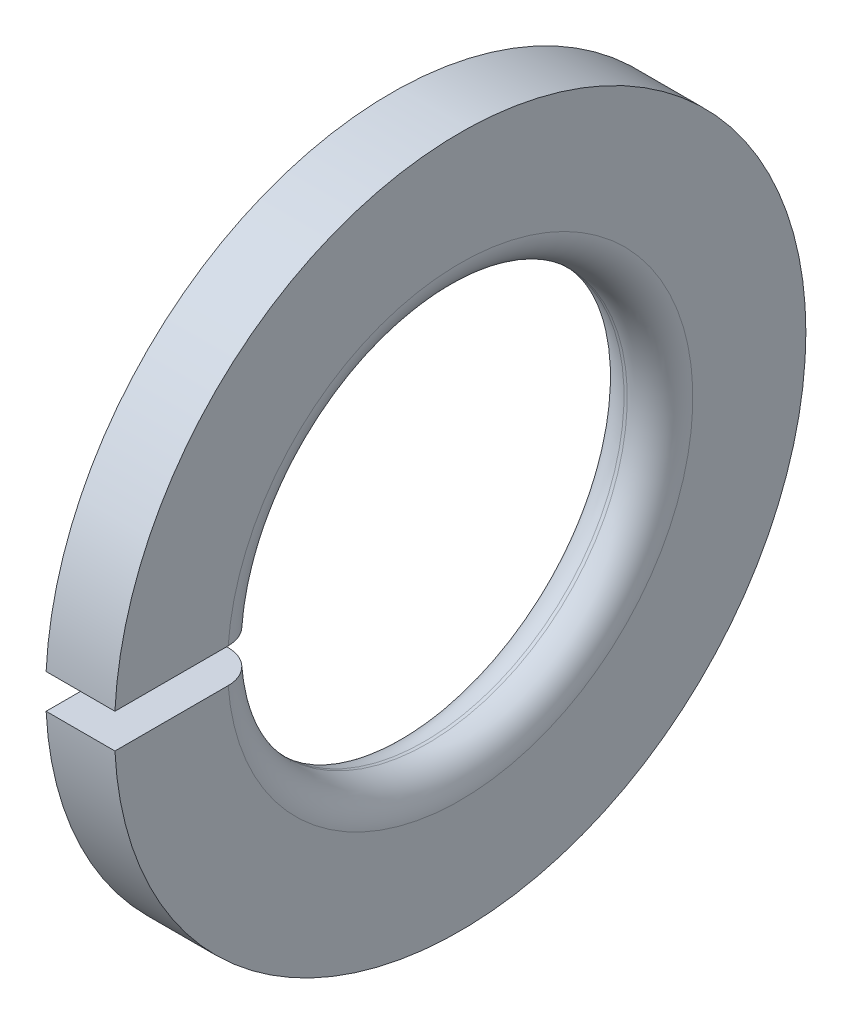
ISO-10303-21;
HEADER;
FILE_DESCRIPTION(('STEP AP214'),'2;1');
FILE_NAME('part.step','',(''),(''),'','','');
FILE_SCHEMA(('AUTOMOTIVE_DESIGN { 1 0 10303 214 1 1 1 1 }'));
ENDSEC;
DATA;
#1=APPLICATION_CONTEXT('core data for automotive mechanical design processes');
#2=APPLICATION_PROTOCOL_DEFINITION('international standard','automotive_design',2000,#1);
#3=PRODUCT_CONTEXT('',#1,'mechanical');
#4=PRODUCT('Part','Part','',(#3));
#5=PRODUCT_RELATED_PRODUCT_CATEGORY('part','',(#4));
#6=PRODUCT_DEFINITION_FORMATION('','',#4);
#7=PRODUCT_DEFINITION_CONTEXT('part definition',#1,'design');
#8=PRODUCT_DEFINITION('design','',#6,#7);
#9=PRODUCT_DEFINITION_SHAPE('','',#8);
#10=(LENGTH_UNIT() NAMED_UNIT(*) SI_UNIT(.MILLI.,.METRE.));
#11=(NAMED_UNIT(*) PLANE_ANGLE_UNIT() SI_UNIT($,.RADIAN.));
#12=(NAMED_UNIT(*) SI_UNIT($,.STERADIAN.) SOLID_ANGLE_UNIT());
#13=UNCERTAINTY_MEASURE_WITH_UNIT(LENGTH_MEASURE(1.E-05),#10,'distance_accuracy_value','');
#14=(GEOMETRIC_REPRESENTATION_CONTEXT(3) GLOBAL_UNCERTAINTY_ASSIGNED_CONTEXT((#13)) GLOBAL_UNIT_ASSIGNED_CONTEXT((#10,
#11,#12)) REPRESENTATION_CONTEXT('',''));
#15=CARTESIAN_POINT('',(0.,0.,0.));
#16=DIRECTION('',(0.,0.,1.));
#17=DIRECTION('',(1.,0.,0.));
#18=AXIS2_PLACEMENT_3D('',#15,#16,#17);
#19=CARTESIAN_POINT('',(-34.925,-3.67761376907083E-13,0.));
#20=DIRECTION('',(-1.,0.,0.));
#21=DIRECTION('',(0.,0.,1.));
#22=AXIS2_PLACEMENT_3D('',#19,#20,#21);
#23=CYLINDRICAL_SURFACE('',#22,10.55);
#24=DIRECTION('',(-1.,0.,0.));
#25=VECTOR('',#24,1.);
#26=CARTESIAN_POINT('',(-34.925,0.52499999999963,10.5369291067179));
#27=LINE('',#26,#25);
#28=CARTESIAN_POINT('',(-5.99520433297585E-12,0.524999999999991,10.5369291067179));
#29=VERTEX_POINT('',#28);
#30=CARTESIAN_POINT('',(-2.10000000000599,0.524999999999991,10.5369291067165));
#31=VERTEX_POINT('',#30);
#32=EDGE_CURVE('E45',#29,#31,#27,.T.);
#33=ORIENTED_EDGE('',*,*,#32,.F.);
#34=CARTESIAN_POINT('',(0.,0.,0.));
#35=DIRECTION('',(-1.,0.,0.));
#36=DIRECTION('',(0.,0.,1.));
#37=AXIS2_PLACEMENT_3D('',#34,#35,#36);
#38=CIRCLE('',#37,10.55);
#39=CARTESIAN_POINT('',(-5.99520433297585E-12,-0.524999999999991,10.5369291067179));
#40=VERTEX_POINT('',#39);
#41=EDGE_CURVE('E106',#29,#40,#38,.T.);
#42=ORIENTED_EDGE('',*,*,#41,.T.);
#43=DIRECTION('',(-1.,0.,0.));
#44=VECTOR('',#43,1.);
#45=CARTESIAN_POINT('',(-34.9250000000059,-0.525000000000019,10.5369291067194));
#46=LINE('',#45,#44);
#47=CARTESIAN_POINT('',(-2.10000000000599,-0.524999999999998,10.5369291067179));
#48=VERTEX_POINT('',#47);
#49=EDGE_CURVE('E87',#48,#40,#46,.F.);
#50=ORIENTED_EDGE('',*,*,#49,.F.);
#51=CARTESIAN_POINT('',(-2.09999999999999,0.,-1.49880108324396E-12));
#52=DIRECTION('',(-1.,0.,0.));
#53=DIRECTION('',(0.,0.,1.));
#54=AXIS2_PLACEMENT_3D('',#51,#52,#53);
#55=CIRCLE('',#54,10.55);
#56=EDGE_CURVE('E118',#31,#48,#55,.T.);
#57=ORIENTED_EDGE('',*,*,#56,.F.);
#58=EDGE_LOOP('',(#33,#42,#50,#57));
#59=FACE_BOUND('',#58,.T.);
#60=ADVANCED_FACE('F32',(#59),#23,.T.);
#61=CARTESIAN_POINT('',(-2.99760216648792E-12,7.10000000000002,1.49880108324396E-12));
#62=DIRECTION('',(-1.,0.,0.));
#63=DIRECTION('',(0.,0.,1.));
#64=AXIS2_PLACEMENT_3D('',#61,#62,#63);
#65=PLANE('',#64);
#66=DIRECTION('',(0.,0.,-1.));
#67=VECTOR('',#66,1.);
#68=CARTESIAN_POINT('',(-5.99520433297585E-12,0.525000000000365,10.761000000003));
#69=LINE('',#68,#67);
#70=CARTESIAN_POINT('',(-5.99520433297585E-12,0.525000000000372,7.08056318381822));
#71=VERTEX_POINT('',#70);
#72=EDGE_CURVE('E92',#29,#71,#69,.T.);
#73=ORIENTED_EDGE('',*,*,#72,.T.);
#74=CARTESIAN_POINT('',(0.,0.,0.));
#75=DIRECTION('',(-1.,0.,0.));
#76=DIRECTION('',(0.,0.,1.));
#77=AXIS2_PLACEMENT_3D('',#74,#75,#76);
#78=CIRCLE('',#77,7.1);
#79=CARTESIAN_POINT('',(-5.99520433297585E-12,-0.524999999999998,7.08056318381528));
#80=VERTEX_POINT('',#79);
#81=EDGE_CURVE('E99',#71,#80,#78,.T.);
#82=ORIENTED_EDGE('',*,*,#81,.T.);
#83=DIRECTION('',(0.,0.,1.));
#84=VECTOR('',#83,1.);
#85=CARTESIAN_POINT('',(0.,-0.524999999999991,1.49880108324396E-12));
#86=LINE('',#85,#84);
#87=EDGE_CURVE('E81',#80,#40,#86,.T.);
#88=ORIENTED_EDGE('',*,*,#87,.T.);
#89=ORIENTED_EDGE('',*,*,#41,.F.);
#90=EDGE_LOOP('',(#73,#82,#88,#89));
#91=FACE_BOUND('',#90,.T.);
#92=ADVANCED_FACE('F105',(#91),#65,.F.);
#93=CARTESIAN_POINT('',(-1.,0.,0.));
#94=DIRECTION('',(-1.,0.,0.));
#95=DIRECTION('',(0.,0.,1.));
#96=AXIS2_PLACEMENT_3D('',#93,#94,#95);
#97=TOROIDAL_SURFACE('',#96,7.1,1.);
#98=ORIENTED_EDGE('',*,*,#81,.F.);
#99=CARTESIAN_POINT('',(-0.812651191739011,0.525000000000386,6.09513809676693));
#100=CARTESIAN_POINT('',(-0.86763560161535,0.52500000000039,6.08461486650558));
#101=CARTESIAN_POINT('',(-0.923548451891167,0.52500000000056,6.07872721250463));
#102=CARTESIAN_POINT('',(-1.03561462487389,0.525000000000171,6.07642288324821));
#103=CARTESIAN_POINT('',(-1.09176815419882,0.524999999999612,6.08001745453107));
#104=CARTESIAN_POINT('',(-1.20265038202974,0.524999999999634,6.09658440071834));
#105=CARTESIAN_POINT('',(-1.2573797852221,0.525000000000213,6.10955204256761));
#106=CARTESIAN_POINT('',(-1.36387256726086,0.525000000000518,6.14448072558383));
#107=CARTESIAN_POINT('',(-1.41563665184332,0.525000000000245,6.16643961664135));
#108=CARTESIAN_POINT('',(-1.51480465325536,0.525000000000194,6.21874173811415));
#109=CARTESIAN_POINT('',(-1.56220424215102,0.525000000000417,6.24909317391763));
#110=CARTESIAN_POINT('',(-1.65125714514086,0.525000000000314,6.31730121336978));
#111=CARTESIAN_POINT('',(-1.69291015600964,0.524999999999988,6.35515821280227));
#112=CARTESIAN_POINT('',(-1.7694226607442,0.525000000000008,6.43742442778355));
#113=CARTESIAN_POINT('',(-1.80426101306152,0.525000000000356,6.48185330578156));
#114=CARTESIAN_POINT('',(-1.86601254338754,0.525000000000375,6.57591381055366));
#115=CARTESIAN_POINT('',(-1.89292559207468,0.525000000000046,6.62554552220737));
#116=CARTESIAN_POINT('',(-1.93814923335575,0.524999999999991,6.72877362821629));
#117=CARTESIAN_POINT('',(-1.9564321571567,0.525000000000267,6.7823821453458));
#118=CARTESIAN_POINT('',(-1.98375580773819,0.525000000000464,6.89190498853988));
#119=CARTESIAN_POINT('',(-1.99279644617394,0.525000000000384,6.94781933664002));
#120=CARTESIAN_POINT('',(-2.00138749269965,0.525000000000333,7.0604687673077));
#121=CARTESIAN_POINT('',(-2.00092170716755,0.525000000000364,7.11720508578948));
#122=CARTESIAN_POINT('',(-1.99046919624121,0.525000000000367,7.22979418626571));
#123=CARTESIAN_POINT('',(-1.98048245114651,0.525000000000341,7.28564696643172));
#124=CARTESIAN_POINT('',(-1.95126829992547,0.525000000000389,7.3948656681672));
#125=CARTESIAN_POINT('',(-1.93204335803151,0.525000000000464,7.44823224875338));
#126=CARTESIAN_POINT('',(-1.88489151384702,0.525000000000267,7.55097199946538));
#127=CARTESIAN_POINT('',(-1.85696468215028,0.524999999999996,7.60034520198325));
#128=CARTESIAN_POINT('',(-1.79325165045152,0.524999999999999,7.69360308767863));
#129=CARTESIAN_POINT('',(-1.75747923414322,0.525000000000272,7.73749718732821));
#130=CARTESIAN_POINT('',(-1.67905745238101,0.525000000000459,7.81863927947436));
#131=CARTESIAN_POINT('',(-1.63640816840962,0.525000000000373,7.85588735070727));
#132=CARTESIAN_POINT('',(-1.54554883853784,0.525000000000372,7.92258902486344));
#133=CARTESIAN_POINT('',(-1.49735183074975,0.525000000000457,7.9520603881383));
#134=CARTESIAN_POINT('',(-1.39668650789791,0.525000000000274,8.00247439358047));
#135=CARTESIAN_POINT('',(-1.34421824229749,0.525000000000006,8.02341713449668));
#136=CARTESIAN_POINT('',(-1.23661255134114,0.525000000000003,8.056138017909));
#137=CARTESIAN_POINT('',(-1.18148066020991,0.525000000000267,8.06793436177014));
#138=CARTESIAN_POINT('',(-1.07001859144208,0.525000000000464,8.0820925822364));
#139=CARTESIAN_POINT('',(-1.01368842281035,0.525000000000396,8.08445452971429));
#140=CARTESIAN_POINT('',(-0.901493761664661,0.525000000000349,8.07967876415247));
#141=CARTESIAN_POINT('',(-0.845628830367014,0.525000000000369,8.07255135099623));
#142=CARTESIAN_POINT('',(-0.735888488378813,0.525000000000362,8.04901957603985));
#143=CARTESIAN_POINT('',(-0.682013074241086,0.525000000000336,8.03261523031435));
#144=CARTESIAN_POINT('',(-0.577772993939425,0.525000000000395,7.99099755957913));
#145=CARTESIAN_POINT('',(-0.527408710822,0.52500000000048,7.96578327524829));
#146=CARTESIAN_POINT('',(-0.43162095206121,0.525000000000251,7.90726737931806));
#147=CARTESIAN_POINT('',(-0.386197502193826,0.524999999999937,7.87396572553036));
#148=CARTESIAN_POINT('',(-0.301516745680129,0.525000000000045,7.80017762775498));
#149=CARTESIAN_POINT('',(-0.262267364873754,0.525000000000468,7.75968208841055));
#150=CARTESIAN_POINT('',(-0.191107272333072,0.525000000000263,7.67268846367339));
#151=CARTESIAN_POINT('',(-0.159196627383164,0.524999999999636,7.62619032366144));
#152=CARTESIAN_POINT('',(-0.10354735848934,0.524999999999638,7.52840777006957));
#153=CARTESIAN_POINT('',(-0.0798260108367196,0.525000000000269,7.47711352456593));
#154=CARTESIAN_POINT('',(-0.0413094029129745,0.525000000000462,7.37127661987449));
#155=CARTESIAN_POINT('',(-0.0265142736285594,0.525000000000024,7.31673391303043));
#156=CARTESIAN_POINT('',(-0.00623645855394657,0.524999999999972,7.20581585945597));
#157=CARTESIAN_POINT('',(-0.00077499732796008,0.52500000000036,7.14943663215186));
#158=CARTESIAN_POINT('',(0.000621201945867997,0.525000000000371,7.03656007759891));
#159=CARTESIAN_POINT('',(-0.00344418248303187,0.524999999999994,6.98006274884109));
#160=CARTESIAN_POINT('',(-0.020998863046643,0.524999999999987,6.86845999383274));
#161=CARTESIAN_POINT('',(-0.0345029987109019,0.525000000000358,6.81335690113727));
#162=CARTESIAN_POINT('',(-0.0705702232947276,0.525000000000373,6.70620167760592));
#163=CARTESIAN_POINT('',(-0.093132990136018,0.525000000000018,6.65414943837279));
#164=CARTESIAN_POINT('',(-0.146679335352683,0.524999999999964,6.55458295560851));
#165=CARTESIAN_POINT('',(-0.177661656099592,0.525000000000266,6.50706803576941));
#166=CARTESIAN_POINT('',(-0.247187964173523,0.525000000000465,6.41791501138081));
#167=CARTESIAN_POINT('',(-0.28573376834286,0.525000000000362,6.37627832299549));
#168=CARTESIAN_POINT('',(-0.369221248758107,0.525000000000369,6.30015644019459));
#169=CARTESIAN_POINT('',(-0.41415296357716,0.52500000000048,6.26566030926566));
#170=CARTESIAN_POINT('',(-0.509152346902679,0.525000000000252,6.2047670808795));
#171=CARTESIAN_POINT('',(-0.559213645070665,0.524999999999914,6.17836009650292));
#172=CARTESIAN_POINT('',(-0.643498874890684,0.525000000000061,6.142647466267));
#173=CARTESIAN_POINT('',(-0.676607139323993,0.525000000000285,6.13064415459991));
#174=CARTESIAN_POINT('',(-0.743905094984735,0.525000000000446,6.11019627403339));
#175=CARTESIAN_POINT('',(-0.778094784431846,0.525000000000384,6.10175169927564));
#176=CARTESIAN_POINT('',(-0.812651191739011,0.525000000000386,6.09513809676693));
#177=B_SPLINE_CURVE_WITH_KNOTS('',3,(#99,#100,#101,#102,#103,#104,#105,#106,#107,#108,#109,#110,
#111,#112,#113,#114,#115,#116,#117,#118,#119,#120,#121,#122,#123,#124,#125,#126,#127,#128,#129,
#130,#131,#132,#133,#134,#135,#136,#137,#138,#139,#140,#141,#142,#143,#144,#145,#146,#147,#148,
#149,#150,#151,#152,#153,#154,#155,#156,#157,#158,#159,#160,#161,#162,#163,#164,#165,#166,#167,
#168,#169,#170,#171,#172,#173,#174,#175,#176),.UNSPECIFIED.,.T.,.F.,(4,2,2,2,2,2,2,2,2,2,2,2,2,
2,2,2,2,2,2,2,2,2,2,2,2,2,2,2,2,2,2,2,2,2,2,2,2,2,4),(0.,0.167818610444027,0.335836354186265,
0.503769314380889,0.671662139600822,0.839719697545483,1.00778611986899,1.1763659518579,
1.34494853450503,1.51406799423438,1.68318907052102,1.85259825840784,2.02200779683156,
2.19137217136273,2.36073517196684,2.5298029734636,2.6988687718595,2.86754505097584,
3.03621937701346,3.20455717280994,3.37289370402228,3.54104766930881,3.70920134322669,
3.87737333323923,4.04554620055123,4.21393322499854,4.3823217817508,4.55106343388026,
4.71980756212841,4.8889349028952,5.05806441796815,5.2274604369871,5.39685043368923,
5.56621514250759,5.7356205847397,5.90476461293485,6.07370107312212,6.17917129306022,
6.2846413393746),.UNSPECIFIED.);
#178=CARTESIAN_POINT('',(-1.000000000006,0.524999999999644,6.07736579448698));
#179=VERTEX_POINT('',#178);
#180=EDGE_CURVE('E125',#71,#179,#177,.T.);
#181=ORIENTED_EDGE('',*,*,#180,.T.);
#182=CARTESIAN_POINT('',(-1.,0.,0.));
#183=DIRECTION('',(-1.,0.,0.));
#184=DIRECTION('',(0.,0.,1.));
#185=AXIS2_PLACEMENT_3D('',#182,#183,#184);
#186=CIRCLE('',#185,6.1);
#187=CARTESIAN_POINT('',(-1.000000000006,-0.525000000000372,6.07736579448842));
#188=VERTEX_POINT('',#187);
#189=EDGE_CURVE('E101',#179,#188,#186,.T.);
#190=ORIENTED_EDGE('',*,*,#189,.T.);
#191=CARTESIAN_POINT('',(-0.812651191739011,-0.52499999999963,6.09513809676687));
#192=CARTESIAN_POINT('',(-0.757551820383527,-0.524999999999582,6.10568846941272));
#193=CARTESIAN_POINT('',(-0.703304669045682,-0.524999999999881,6.12090939679912));
#194=CARTESIAN_POINT('',(-0.59809494605691,-0.525000000000101,6.16026480787424));
#195=CARTESIAN_POINT('',(-0.547136476731266,-0.525000000000022,6.18441018084307));
#196=CARTESIAN_POINT('',(-0.450021059867926,-0.524999999999959,6.24089704258308));
#197=CARTESIAN_POINT('',(-0.403861219141078,-0.524999999999976,6.27323355185655));
#198=CARTESIAN_POINT('',(-0.317622415274921,-0.525000000000005,6.34517125918391));
#199=CARTESIAN_POINT('',(-0.277541983739865,-0.525000000000018,6.38477069785813));
#200=CARTESIAN_POINT('',(-0.204475274851348,-0.524999999999963,6.47021702811084));
#201=CARTESIAN_POINT('',(-0.171506620943298,-0.524999999999895,6.51607899006744));
#202=CARTESIAN_POINT('',(-0.113707633490496,-0.525000000000087,6.6126750006093));
#203=CARTESIAN_POINT('',(-0.0888777550488546,-0.525000000000348,6.66340932144153));
#204=CARTESIAN_POINT('',(-0.0479873967017835,-0.525000000000397,6.76847554061448));
#205=CARTESIAN_POINT('',(-0.0319538960510874,-0.525000000000184,6.82281794020373));
#206=CARTESIAN_POINT('',(-0.00922268898939762,-0.524999999999797,6.93342153693535));
#207=CARTESIAN_POINT('',(-0.00252506206479261,-0.524999999999623,6.98968275041049));
#208=CARTESIAN_POINT('',(0.00134687490064148,-0.524999999999623,7.10261487774892));
#209=CARTESIAN_POINT('',(-0.00149276131561704,-0.524999999999799,7.15928627056638));
#210=CARTESIAN_POINT('',(-0.0166506062855857,-0.525000000000182,7.27134714691431));
#211=CARTESIAN_POINT('',(-0.0289687946271112,-0.52500000000039,7.3267366332051));
#212=CARTESIAN_POINT('',(-0.0627331922052648,-0.525000000000341,7.43463047401095));
#213=CARTESIAN_POINT('',(-0.0841749236068021,-0.525000000000085,7.48713622960659));
#214=CARTESIAN_POINT('',(-0.135585095868142,-0.524999999999897,7.58779315210848));
#215=CARTESIAN_POINT('',(-0.165553473441034,-0.524999999999965,7.63594435133184));
#216=CARTESIAN_POINT('',(-0.233108214583372,-0.525000000000017,7.72642784102541));
#217=CARTESIAN_POINT('',(-0.270680263460048,-0.525000000000001,7.7687708184043));
#218=CARTESIAN_POINT('',(-0.352414617323743,-0.524999999999981,7.84652983199612));
#219=CARTESIAN_POINT('',(-0.396576839435855,-0.524999999999976,7.88194595530494));
#220=CARTESIAN_POINT('',(-0.490128313923088,-0.525000000000033,7.94475961565226));
#221=CARTESIAN_POINT('',(-0.539505264717276,-0.525000000000094,7.97217547432841));
#222=CARTESIAN_POINT('',(-0.642167542778622,-0.524999999999888,8.01831006363455));
#223=CARTESIAN_POINT('',(-0.695452826774186,-0.524999999999622,8.03702889053799));
#224=CARTESIAN_POINT('',(-0.804309707927125,-0.524999999999624,8.06520338795604));
#225=CARTESIAN_POINT('',(-0.859876747633011,-0.524999999999892,8.07467666879472));
#226=CARTESIAN_POINT('',(-0.971812435773961,-0.525000000000089,8.08415006833431));
#227=CARTESIAN_POINT('',(-1.02818107864394,-0.525000000000019,8.08415025276961));
#228=CARTESIAN_POINT('',(-1.1400634617036,-0.525000000000019,8.0746820931035));
#229=CARTESIAN_POINT('',(-1.19557795970516,-0.525000000000089,8.06522270014537));
#230=CARTESIAN_POINT('',(-1.30423144094737,-0.524999999999892,8.03712034151092));
#231=CARTESIAN_POINT('',(-1.35737042598148,-0.524999999999624,8.01847738276809));
#232=CARTESIAN_POINT('',(-1.45978125760765,-0.524999999999622,7.97253595372823));
#233=CARTESIAN_POINT('',(-1.50905208951595,-0.524999999999887,7.94523522174864));
#234=CARTESIAN_POINT('',(-1.6023193775826,-0.525000000000095,7.88276033178027));
#235=CARTESIAN_POINT('',(-1.64631580509632,-0.525000000000038,7.84758613103467));
#236=CARTESIAN_POINT('',(-1.72785344321041,-0.524999999999986,7.77031242493913));
#237=CARTESIAN_POINT('',(-1.76538552963427,-0.524999999999991,7.72820329244019));
#238=CARTESIAN_POINT('',(-1.83286562277719,-0.524999999999991,7.63829324855417));
#239=CARTESIAN_POINT('',(-1.86281354537835,-0.524999999999986,7.59049227404607));
#240=CARTESIAN_POINT('',(-1.91434492958983,-0.525000000000037,7.49044548050609));
#241=CARTESIAN_POINT('',(-1.93591017809057,-0.525000000000094,7.4381902805621));
#242=CARTESIAN_POINT('',(-1.96998371435096,-0.524999999999887,7.33080620793293));
#243=CARTESIAN_POINT('',(-1.98249189522443,-0.524999999999623,7.27567730134219));
#244=CARTESIAN_POINT('',(-1.9981234719868,-0.524999999999623,7.16397881234709));
#245=CARTESIAN_POINT('',(-2.00122582734279,-0.524999999999889,7.10740628502683));
#246=CARTESIAN_POINT('',(-1.99790326108501,-0.525000000000093,6.99454140302635));
#247=CARTESIAN_POINT('',(-1.99147822288672,-0.525000000000031,6.93824905178304));
#248=CARTESIAN_POINT('',(-1.96926763972439,-0.524999999999978,6.82745983678992));
#249=CARTESIAN_POINT('',(-1.95346900171992,-0.524999999999987,6.77296559724879));
#250=CARTESIAN_POINT('',(-1.91294486876417,-0.524999999999994,6.66740346112882));
#251=CARTESIAN_POINT('',(-1.88821933806418,-0.524999999999992,6.61633557827217));
#252=CARTESIAN_POINT('',(-1.83054378341638,-0.524999999999989,6.51909489101593));
#253=CARTESIAN_POINT('',(-1.79759596406104,-0.524999999999988,6.47292077919953));
#254=CARTESIAN_POINT('',(-1.72440111454963,-0.524999999999994,6.38677676254131));
#255=CARTESIAN_POINT('',(-1.68415444354468,-0.525000000000001,6.34680655260657));
#256=CARTESIAN_POINT('',(-1.59760183616129,-0.524999999999994,6.27430667984283));
#257=CARTESIAN_POINT('',(-1.55131036393126,-0.524999999999981,6.2417597494312));
#258=CARTESIAN_POINT('',(-1.45389218246537,-0.525000000000001,6.18492227475709));
#259=CARTESIAN_POINT('',(-1.40276435945105,-0.525000000000035,6.16063363826905));
#260=CARTESIAN_POINT('',(-1.29730119775418,-0.524999999999974,6.12108940160269));
#261=CARTESIAN_POINT('',(-1.24297553120601,-0.52499999999988,6.10580796129352));
#262=CARTESIAN_POINT('',(-1.13257168096271,-0.525000000000102,6.08463105977216));
#263=CARTESIAN_POINT('',(-1.07649573567946,-0.525000000000418,6.07872407381989));
#264=CARTESIAN_POINT('',(-0.985554768614343,-0.525000000000333,6.07686069334207));
#265=CARTESIAN_POINT('',(-0.950724049165604,-0.525000000000159,6.07797678644243));
#266=CARTESIAN_POINT('',(-0.881369871437204,-0.524999999999822,6.08384165906412));
#267=CARTESIAN_POINT('',(-0.846846412434104,-0.52499999999966,6.08859043003012));
#268=CARTESIAN_POINT('',(-0.812651191739011,-0.52499999999963,6.09513809676687));
#269=B_SPLINE_CURVE_WITH_KNOTS('',3,(#191,#192,#193,#194,#195,#196,#197,#198,#199,#200,#201,
#202,#203,#204,#205,#206,#207,#208,#209,#210,#211,#212,#213,#214,#215,#216,#217,#218,#219,#220,
#221,#222,#223,#224,#225,#226,#227,#228,#229,#230,#231,#232,#233,#234,#235,#236,#237,#238,#239,
#240,#241,#242,#243,#244,#245,#246,#247,#248,#249,#250,#251,#252,#253,#254,#255,#256,#257,#258,
#259,#260,#261,#262,#263,#264,#265,#266,#267,#268),.UNSPECIFIED.,.T.,.F.,(4,2,2,2,2,2,2,2,2,2,2,
2,2,2,2,2,2,2,2,2,2,2,2,2,2,2,2,2,2,2,2,2,2,2,2,2,2,2,4),(0.,0.168173561321617,
0.336553002906382,0.504830329078898,0.673066945285205,0.841715791619334,1.0103740668321,
1.17954678020889,1.34872093392713,1.51814257718406,1.6875638555903,1.8569020777685,
2.02623904310866,2.19526013121228,2.36427909396563,2.53290788785009,2.7015348150217,
2.86983992190338,3.03814386090582,3.20628869253537,3.37443339721767,3.54262206281626,
3.71081164178454,3.87923670252184,4.04766363122281,4.21645448401653,4.38524732874826,
4.55441748015038,4.7235897016659,4.89299878102369,5.06240853880611,5.2317729224874,
5.40112897459627,5.57008696917327,5.73908396879025,5.90759375448957,6.07589621718153,
6.18026665638203,6.28463684977989),.UNSPECIFIED.);
#270=EDGE_CURVE('E84',#188,#80,#269,.T.);
#271=ORIENTED_EDGE('',*,*,#270,.T.);
#272=EDGE_LOOP('',(#98,#181,#190,#271));
#273=FACE_BOUND('',#272,.T.);
#274=ADVANCED_FACE('F97',(#273),#97,.T.);
#275=CARTESIAN_POINT('',(-34.925,-3.67761376907083E-13,0.));
#276=DIRECTION('',(-1.,0.,0.));
#277=DIRECTION('',(0.,0.,1.));
#278=AXIS2_PLACEMENT_3D('',#275,#276,#277);
#279=CYLINDRICAL_SURFACE('',#278,6.1);
#280=DIRECTION('',(-1.,0.,0.));
#281=VECTOR('',#280,1.);
#282=CARTESIAN_POINT('',(-34.9250000000059,0.524999999999991,6.07736579448692));
#283=LINE('',#282,#281);
#284=CARTESIAN_POINT('',(-1.10000000000599,0.524999999999991,6.07736579448698));
#285=VERTEX_POINT('',#284);
#286=EDGE_CURVE('E133',#285,#179,#283,.F.);
#287=ORIENTED_EDGE('',*,*,#286,.F.);
#288=CARTESIAN_POINT('',(-1.09999999999999,-3.67761376907083E-13,0.));
#289=DIRECTION('',(-1.,0.,0.));
#290=DIRECTION('',(0.,0.,1.));
#291=AXIS2_PLACEMENT_3D('',#288,#289,#290);
#292=CIRCLE('',#291,6.1);
#293=CARTESIAN_POINT('',(-1.10000000000599,-0.525000000000379,6.07736579448842));
#294=VERTEX_POINT('',#293);
#295=EDGE_CURVE('E109',#285,#294,#292,.T.);
#296=ORIENTED_EDGE('',*,*,#295,.T.);
#297=DIRECTION('',(-1.,0.,0.));
#298=VECTOR('',#297,1.);
#299=CARTESIAN_POINT('',(-34.9250000000059,-0.525000000000012,6.07736579448842));
#300=LINE('',#299,#298);
#301=EDGE_CURVE('E102',#188,#294,#300,.T.);
#302=ORIENTED_EDGE('',*,*,#301,.F.);
#303=ORIENTED_EDGE('',*,*,#189,.F.);
#304=EDGE_LOOP('',(#287,#296,#302,#303));
#305=FACE_BOUND('',#304,.T.);
#306=ADVANCED_FACE('F132',(#305),#279,.F.);
#307=CARTESIAN_POINT('',(-1.09999999999999,-3.67761376907083E-13,0.));
#308=DIRECTION('',(-1.,0.,0.));
#309=DIRECTION('',(0.,0.,1.));
#310=AXIS2_PLACEMENT_3D('',#307,#308,#309);
#311=TOROIDAL_SURFACE('',#310,7.1,1.);
#312=ORIENTED_EDGE('',*,*,#295,.F.);
#313=CARTESIAN_POINT('',(-1.5961819299769,0.525000000000019,6.2096275846848));
#314=CARTESIAN_POINT('',(-1.64499939934069,0.524999999999903,6.23762894619343));
#315=CARTESIAN_POINT('',(-1.69148224423684,0.525000000000346,6.26978458655136));
#316=CARTESIAN_POINT('',(-1.77842234714044,0.525000000000384,6.34147727590411));
#317=CARTESIAN_POINT('',(-1.81887203434511,0.524999999999978,6.38102346122214));
#318=CARTESIAN_POINT('',(-1.89254170806743,0.525000000000017,6.46632022317165));
#319=CARTESIAN_POINT('',(-1.92576613310789,0.525000000000462,6.51206696256452));
#320=CARTESIAN_POINT('',(-1.98407371178963,0.525000000000269,6.60846581359178));
#321=CARTESIAN_POINT('',(-2.00915888981271,0.524999999999631,6.65911670139786));
#322=CARTESIAN_POINT('',(-2.05055000696703,0.524999999999629,6.76402361407294));
#323=CARTESIAN_POINT('',(-2.06683540250733,0.525000000000268,6.81828774566904));
#324=CARTESIAN_POINT('',(-2.0900808554344,0.525000000000463,6.92878037348317));
#325=CARTESIAN_POINT('',(-2.09704044408114,0.52500000000002,6.98500896829463));
#326=CARTESIAN_POINT('',(-2.10143870114839,0.524999999999961,7.09792065593832));
#327=CARTESIAN_POINT('',(-2.09886335326762,0.525000000000347,7.15460429554524));
#328=CARTESIAN_POINT('',(-2.08422851491701,0.525000000000384,7.26673393732416));
#329=CARTESIAN_POINT('',(-2.07216904348183,0.525000000000034,7.32217994197987));
#330=CARTESIAN_POINT('',(-2.03890864291307,0.524999999999975,7.43023100101064));
#331=CARTESIAN_POINT('',(-2.01771195991169,0.525000000000266,7.48283736222825));
#332=CARTESIAN_POINT('',(-1.96677164822669,0.525000000000465,7.58373519455236));
#333=CARTESIAN_POINT('',(-1.93702810785368,0.525000000000372,7.63202671023537));
#334=CARTESIAN_POINT('',(-1.86989546527341,0.525000000000373,7.72282712210357));
#335=CARTESIAN_POINT('',(-1.83252062306384,0.525000000000467,7.76534656090853));
#336=CARTESIAN_POINT('',(-1.75114811491809,0.525000000000264,7.84348923639547));
#337=CARTESIAN_POINT('',(-1.70715052212912,0.524999999999968,7.87911254923409));
#338=CARTESIAN_POINT('',(-1.61389071511993,0.525000000000027,7.94236479434585));
#339=CARTESIAN_POINT('',(-1.56464089178453,0.52500000000038,7.97001199615059));
#340=CARTESIAN_POINT('',(-1.46219213102084,0.525000000000351,8.01662725189567));
#341=CARTESIAN_POINT('',(-1.40899323965151,0.52499999999997,8.03559540704339));
#342=CARTESIAN_POINT('',(-1.30026632809162,0.525000000000026,8.06427874880619));
#343=CARTESIAN_POINT('',(-1.24474297186284,0.525000000000461,8.07401161641912));
#344=CARTESIAN_POINT('',(-1.13285039114978,0.52500000000027,8.08400768289598));
#345=CARTESIAN_POINT('',(-1.07648117244892,0.524999999999642,8.08427094647692));
#346=CARTESIAN_POINT('',(-0.964554375910717,0.52499999999959,8.07532469263965));
#347=CARTESIAN_POINT('',(-0.908996070071417,0.525000000000163,8.06612427930735));
#348=CARTESIAN_POINT('',(-0.800212185836647,0.525000000000568,8.03852869170669));
#349=CARTESIAN_POINT('',(-0.746986605257841,0.5250000000004,8.02013352604444));
#350=CARTESIAN_POINT('',(-0.644363202838789,0.525000000000345,7.97466988242912));
#351=CARTESIAN_POINT('',(-0.594966319976288,0.525000000000459,7.9475992851557));
#352=CARTESIAN_POINT('',(-0.501410212196287,0.525000000000272,7.88556015966903));
#353=CARTESIAN_POINT('',(-0.457251016218617,0.524999999999971,7.85059158782015));
#354=CARTESIAN_POINT('',(-0.375356149990863,0.525000000000025,7.77369964832303));
#355=CARTESIAN_POINT('',(-0.337629470170214,0.525000000000381,7.73176670578561));
#356=CARTESIAN_POINT('',(-0.269733506308345,0.52500000000035,7.64217394347855));
#357=CARTESIAN_POINT('',(-0.239564301579613,0.524999999999963,7.59451406361491));
#358=CARTESIAN_POINT('',(-0.187569599073347,0.525000000000019,7.494711038411));
#359=CARTESIAN_POINT('',(-0.165762211413736,0.525000000000464,7.4425584583576));
#360=CARTESIAN_POINT('',(-0.131190554984548,0.525000000000267,7.33533755446106));
#361=CARTESIAN_POINT('',(-0.118426406336247,0.524999999999625,7.28026919189806));
#362=CARTESIAN_POINT('',(-0.102275636966083,0.524999999999621,7.16864788723514));
#363=CARTESIAN_POINT('',(-0.0989100943311956,0.525000000000263,7.11209189488876));
#364=CARTESIAN_POINT('',(-0.101707069423467,0.525000000000468,6.99921588255545));
#365=CARTESIAN_POINT('',(-0.107869676491819,0.525000000000032,6.9428958647861));
#366=CARTESIAN_POINT('',(-0.129563290118812,0.524999999999978,6.83200648689195));
#367=CARTESIAN_POINT('',(-0.1451075832865,0.525000000000362,6.77743972542862));
#368=CARTESIAN_POINT('',(-0.185138557495117,0.525000000000369,6.67169074645916));
#369=CARTESIAN_POINT('',(-0.20962527541692,0.524999999999993,6.62050854291285));
#370=CARTESIAN_POINT('',(-0.266845760595302,0.524999999999988,6.52300018035214));
#371=CARTESIAN_POINT('',(-0.299577372428211,0.525000000000359,6.47667275665082));
#372=CARTESIAN_POINT('',(-0.372369770694565,0.525000000000372,6.39018581260531));
#373=CARTESIAN_POINT('',(-0.412430499638894,0.525000000000016,6.35002624388543));
#374=CARTESIAN_POINT('',(-0.498652958488998,0.524999999999966,6.27711402852628));
#375=CARTESIAN_POINT('',(-0.544801058003782,0.52500000000027,6.24434526456614));
#376=CARTESIAN_POINT('',(-0.641956901348875,0.525000000000461,6.18705245912368));
#377=CARTESIAN_POINT('',(-0.692964359977188,0.525000000000347,6.16252793415857));
#378=CARTESIAN_POINT('',(-0.798202983307868,0.525000000000398,6.12250657361788));
#379=CARTESIAN_POINT('',(-0.852422370418955,0.525000000000563,6.10697876382092));
#380=CARTESIAN_POINT('',(-0.962716440601181,0.525000000000168,6.08527043712887));
#381=CARTESIAN_POINT('',(-1.01879155206004,0.524999999999607,6.07909209412606));
#382=CARTESIAN_POINT('',(-1.13105197071983,0.52499999999968,6.07627085223478));
#383=CARTESIAN_POINT('',(-1.18723676548846,0.525000000000311,6.07960704264015));
#384=CARTESIAN_POINT('',(-1.29819861358481,0.52500000000042,6.09567378970573));
#385=CARTESIAN_POINT('',(-1.35297729476796,0.524999999999899,6.10839292439418));
#386=CARTESIAN_POINT('',(-1.4392727428218,0.525000000000059,6.13625373493297));
#387=CARTESIAN_POINT('',(-1.4717087997751,0.525000000000358,6.14863149948046));
#388=CARTESIAN_POINT('',(-1.53511949424877,0.525000000000373,6.17668935162707));
#389=CARTESIAN_POINT('',(-1.56609413413627,0.52500000000009,6.19236943387707));
#390=CARTESIAN_POINT('',(-1.5961819299769,0.525000000000019,6.2096275846848));
#391=B_SPLINE_CURVE_WITH_KNOTS('',3,(#313,#314,#315,#316,#317,#318,#319,#320,#321,#322,#323,
#324,#325,#326,#327,#328,#329,#330,#331,#332,#333,#334,#335,#336,#337,#338,#339,#340,#341,#342,
#343,#344,#345,#346,#347,#348,#349,#350,#351,#352,#353,#354,#355,#356,#357,#358,#359,#360,#361,
#362,#363,#364,#365,#366,#367,#368,#369,#370,#371,#372,#373,#374,#375,#376,#377,#378,#379,#380,
#381,#382,#383,#384,#385,#386,#387,#388,#389,#390),.UNSPECIFIED.,.T.,.F.,(4,2,2,2,2,2,2,2,2,2,2,
2,2,2,2,2,2,2,2,2,2,2,2,2,2,2,2,2,2,2,2,2,2,2,2,2,2,2,4),(0.,0.168707070113161,
0.337624095301283,0.506437058754311,0.675208003047599,0.844371268821392,1.01354303687515,
1.18296358511457,1.35238379332749,1.52172535540356,1.69106516781642,1.86009139783816,
2.02911576113006,2.19774983784399,2.36638194804608,2.53469055604756,2.70299801379677,
2.87114371055038,3.03928924992317,3.20747589690525,3.37566347312693,3.54408422395575,
3.71250674221472,3.88129199878343,4.05007949728343,4.21924522968119,4.38841254827991,
4.55782001044352,4.72722817129525,4.89659209045186,5.06595468118592,5.234944288544,
5.40392398378919,5.57231839856817,5.74075196158011,5.9088156327003,6.07667505477111,
6.18065488352392,6.28463454385024),.UNSPECIFIED.);
#392=CARTESIAN_POINT('',(-2.10000000000599,0.525000000000005,7.08056318381822));
#393=VERTEX_POINT('',#392);
#394=EDGE_CURVE('E119',#285,#393,#391,.T.);
#395=ORIENTED_EDGE('',*,*,#394,.T.);
#396=CARTESIAN_POINT('',(-2.09999999999999,0.,-1.49880108324396E-12));
#397=DIRECTION('',(-1.,0.,0.));
#398=DIRECTION('',(0.,0.,1.));
#399=AXIS2_PLACEMENT_3D('',#396,#397,#398);
#400=CIRCLE('',#399,7.1);
#401=CARTESIAN_POINT('',(-2.10000000000599,-0.525000000000005,7.08056318381528));
#402=VERTEX_POINT('',#401);
#403=EDGE_CURVE('E122',#393,#402,#400,.T.);
#404=ORIENTED_EDGE('',*,*,#403,.T.);
#405=CARTESIAN_POINT('',(-1.5961819299769,-0.524999999999998,6.2096275846848));
#406=CARTESIAN_POINT('',(-1.5475828772614,-0.524999999999958,6.18175725755731));
#407=CARTESIAN_POINT('',(-1.496599997049,-0.524999999999989,6.15796321010824));
#408=CARTESIAN_POINT('',(-1.39132203699483,-0.524999999999993,6.11925048173566));
#409=CARTESIAN_POINT('',(-1.3370231688924,-0.524999999999966,6.10434216939362));
#410=CARTESIAN_POINT('',(-1.2267084262382,-0.525000000000015,6.08386657634102));
#411=CARTESIAN_POINT('',(-1.17069323462752,-0.525000000000092,6.07829562812097));
#412=CARTESIAN_POINT('',(-1.05853843963109,-0.52499999999989,6.07665039060405));
#413=CARTESIAN_POINT('',(-1.00239886990599,-0.524999999999611,6.08057378637775));
#414=CARTESIAN_POINT('',(-0.891629364012496,-0.524999999999662,6.09778856677507));
#415=CARTESIAN_POINT('',(-0.836998054702247,-0.524999999999991,6.11107111737282));
#416=CARTESIAN_POINT('',(-0.730734958810036,-0.524999999999991,6.14660984299879));
#417=CARTESIAN_POINT('',(-0.679103295717233,-0.524999999999663,6.16886638716848));
#418=CARTESIAN_POINT('',(-0.580240599313767,-0.524999999999611,6.22174053900494));
#419=CARTESIAN_POINT('',(-0.533014600206025,-0.524999999999888,6.25236755809059));
#420=CARTESIAN_POINT('',(-0.444354184060183,-0.525000000000093,6.32109246353495));
#421=CARTESIAN_POINT('',(-0.402919846456383,-0.525000000000021,6.35919045234293));
#422=CARTESIAN_POINT('',(-0.326880902353813,-0.52499999999996,6.44190079158876));
#423=CARTESIAN_POINT('',(-0.292297816953563,-0.524999999999972,6.48653292678932));
#424=CARTESIAN_POINT('',(-0.231087348840997,-0.525000000000009,6.58095443393689));
#425=CARTESIAN_POINT('',(-0.204460095074094,-0.525000000000034,6.63074388945438));
#426=CARTESIAN_POINT('',(-0.159831972468196,-0.524999999999975,6.73423719167386));
#427=CARTESIAN_POINT('',(-0.141858705258774,-0.524999999999891,6.78795294192622));
#428=CARTESIAN_POINT('',(-0.115168236541906,-0.52500000000009,6.89763705265294));
#429=CARTESIAN_POINT('',(-0.106451148399393,-0.525000000000372,6.95360544070775));
#430=CARTESIAN_POINT('',(-0.0985128850452394,-0.525000000000373,7.06630610122085));
#431=CARTESIAN_POINT('',(-0.0993075897062783,-0.525000000000089,7.12303949311759));
#432=CARTESIAN_POINT('',(-0.110413094892,-0.524999999999892,7.23556740735689));
#433=CARTESIAN_POINT('',(-0.120723899716897,-0.524999999999978,7.29136192927518));
#434=CARTESIAN_POINT('',(-0.15057161361393,-0.525000000000031,7.40040865897007));
#435=CARTESIAN_POINT('',(-0.170105774685661,-0.524999999999999,7.45366161877798));
#436=CARTESIAN_POINT('',(-0.217852713264445,-0.524999999999983,7.55612367429783));
#437=CARTESIAN_POINT('',(-0.246065423934753,-0.525,7.60533280114913));
#438=CARTESIAN_POINT('',(-0.310317614044554,-0.525000000000009,7.69821609725328));
#439=CARTESIAN_POINT('',(-0.346343223500014,-0.525000000000002,7.74189986066075));
#440=CARTESIAN_POINT('',(-0.425232386963139,-0.524999999999979,7.82258164656617));
#441=CARTESIAN_POINT('',(-0.468095858567335,-0.524999999999964,7.85957974962193));
#442=CARTESIAN_POINT('',(-0.559337865891414,-0.525000000000018,7.92574956596045));
#443=CARTESIAN_POINT('',(-0.607703459594838,-0.525000000000088,7.95493912525911));
#444=CARTESIAN_POINT('',(-0.708656100997956,-0.524999999999894,8.00476528378459));
#445=CARTESIAN_POINT('',(-0.761243100367928,-0.524999999999631,8.02540198091412));
#446=CARTESIAN_POINT('',(-0.869033436165569,-0.524999999999629,8.0574961637724));
#447=CARTESIAN_POINT('',(-0.924231375816792,-0.524999999999888,8.06897177650136));
#448=CARTESIAN_POINT('',(-1.03577067381966,-0.525000000000093,8.08248218489812));
#449=CARTESIAN_POINT('',(-1.09211202348121,-0.525000000000039,8.08451705229012));
#450=CARTESIAN_POINT('',(-1.20427502184373,-0.524999999999985,8.07909049479809));
#451=CARTESIAN_POINT('',(-1.26009716039024,-0.524999999999985,8.07163918751735));
#452=CARTESIAN_POINT('',(-1.36969824315914,-0.524999999999996,8.04747160481721));
#453=CARTESIAN_POINT('',(-1.42347718960275,-0.525000000000007,8.03075533947034));
#454=CARTESIAN_POINT('',(-1.52747461459567,-0.525000000000002,7.98853421708074));
#455=CARTESIAN_POINT('',(-1.57769262747742,-0.524999999999987,7.96302821313964));
#456=CARTESIAN_POINT('',(-1.67314103914949,-0.524999999999995,7.90395771710115));
#457=CARTESIAN_POINT('',(-1.71837141868173,-0.525000000000018,7.87039319389009));
#458=CARTESIAN_POINT('',(-1.80262536267168,-0.525000000000019,7.79611462797682));
#459=CARTESIAN_POINT('',(-1.8416408408766,-0.524999999999997,7.75539141356543));
#460=CARTESIAN_POINT('',(-1.91229848896567,-0.524999999999985,7.66798477487318));
#461=CARTESIAN_POINT('',(-1.94394057001567,-0.524999999999996,7.62130127879378));
#462=CARTESIAN_POINT('',(-1.99902518236124,-0.525,7.52319487122736));
#463=CARTESIAN_POINT('',(-2.02245031532366,-0.524999999999993,7.47176219117663));
#464=CARTESIAN_POINT('',(-2.06035545298469,-0.524999999999989,7.36569996237089));
#465=CARTESIAN_POINT('',(-2.07483532538803,-0.524999999999991,7.31107036634841));
#466=CARTESIAN_POINT('',(-2.09447186525568,-0.524999999999991,7.20003147831842));
#467=CARTESIAN_POINT('',(-2.09960713397141,-0.524999999999988,7.14361840174165));
#468=CARTESIAN_POINT('',(-2.10034938841895,-0.524999999999994,7.0307315720194));
#469=CARTESIAN_POINT('',(-2.09595664161789,-0.525000000000003,6.97425782062164));
#470=CARTESIAN_POINT('',(-2.07775678631854,-0.525000000000007,6.8627651246092));
#471=CARTESIAN_POINT('',(-2.06393620574518,-0.525000000000001,6.80774837903561));
#472=CARTESIAN_POINT('',(-2.02724958760907,-0.52499999999998,6.70080112177388));
#473=CARTESIAN_POINT('',(-2.00438128047753,-0.524999999999964,6.64887138820682));
#474=CARTESIAN_POINT('',(-1.95023672400987,-0.525000000000032,6.54957631774877));
#475=CARTESIAN_POINT('',(-1.91895711852767,-0.525000000000116,6.50221281307405));
#476=CARTESIAN_POINT('',(-1.84889490463404,-0.524999999999866,6.41346828015907));
#477=CARTESIAN_POINT('',(-1.81012142104938,-0.524999999999532,6.37208008216004));
#478=CARTESIAN_POINT('',(-1.74181828668467,-0.52499999999968,6.31052284592253));
#479=CARTESIAN_POINT('',(-1.71421000293983,-0.524999999999905,6.28818503266922));
#480=CARTESIAN_POINT('',(-1.65678047196014,-0.525000000000076,6.2465624026676));
#481=CARTESIAN_POINT('',(-1.6269592254384,-0.525000000000023,6.22727758493547));
#482=CARTESIAN_POINT('',(-1.5961819299769,-0.524999999999998,6.2096275846848));
#483=B_SPLINE_CURVE_WITH_KNOTS('',3,(#405,#406,#407,#408,#409,#410,#411,#412,#413,#414,#415,
#416,#417,#418,#419,#420,#421,#422,#423,#424,#425,#426,#427,#428,#429,#430,#431,#432,#433,#434,
#435,#436,#437,#438,#439,#440,#441,#442,#443,#444,#445,#446,#447,#448,#449,#450,#451,#452,#453,
#454,#455,#456,#457,#458,#459,#460,#461,#462,#463,#464,#465,#466,#467,#468,#469,#470,#471,#472,
#473,#474,#475,#476,#477,#478,#479,#480,#481,#482),.UNSPECIFIED.,.T.,.F.,(4,2,2,2,2,2,2,2,2,2,2,
2,2,2,2,2,2,2,2,2,2,2,2,2,2,2,2,2,2,2,2,2,2,2,2,2,2,2,4),(0.,0.167941139718315,0.33607786477698,
0.504148533970559,0.672178227975598,0.840049532286273,1.00792774261738,1.17599549042337,
1.34406554310063,1.51265544481035,1.68124807881961,1.85037492940337,2.01950385134217,
2.18891517218344,2.35832656957975,2.52768752448,2.69704717510103,2.86610859292417,
3.03516797353236,3.20383761133554,3.37250531836142,3.54083845028291,3.70917030332494,
3.87732277015406,4.04547505417432,4.21364928727117,4.38182416969339,4.55021610923887,
4.71861007745311,4.88735847604984,5.0561093702789,5.22524621296843,5.39437830776898,
5.56375259463802,5.73316939501122,5.90265389401462,6.07193330790162,6.17828879127119,
6.28464424036829),.UNSPECIFIED.);
#484=EDGE_CURVE('E53',#402,#294,#483,.T.);
#485=ORIENTED_EDGE('',*,*,#484,.T.);
#486=EDGE_LOOP('',(#312,#395,#404,#485));
#487=FACE_BOUND('',#486,.T.);
#488=ADVANCED_FACE('F136',(#487),#311,.T.);
#489=CARTESIAN_POINT('',(-2.09999999999699,10.55,1.49880108324396E-12));
#490=DIRECTION('',(1.,0.,0.));
#491=DIRECTION('',(0.,0.,-1.));
#492=AXIS2_PLACEMENT_3D('',#489,#490,#491);
#493=PLANE('',#492);
#494=DIRECTION('',(0.,0.,-1.));
#495=VECTOR('',#494,1.);
#496=CARTESIAN_POINT('',(-2.09999999999999,0.524999999999991,0.));
#497=LINE('',#496,#495);
#498=EDGE_CURVE('E11',#31,#393,#497,.T.);
#499=ORIENTED_EDGE('',*,*,#498,.F.);
#500=ORIENTED_EDGE('',*,*,#56,.T.);
#501=DIRECTION('',(0.,0.,1.));
#502=VECTOR('',#501,1.);
#503=CARTESIAN_POINT('',(-2.09999999999999,-0.524999999999991,0.));
#504=LINE('',#503,#502);
#505=EDGE_CURVE('E39',#402,#48,#504,.T.);
#506=ORIENTED_EDGE('',*,*,#505,.F.);
#507=ORIENTED_EDGE('',*,*,#403,.F.);
#508=EDGE_LOOP('',(#499,#500,#506,#507));
#509=FACE_BOUND('',#508,.T.);
#510=ADVANCED_FACE('F121',(#509),#493,.F.);
#511=CARTESIAN_POINT('',(-2.09999999999999,-0.524999999999991,0.));
#512=DIRECTION('',(0.,1.,0.));
#513=DIRECTION('',(0.,0.,1.));
#514=AXIS2_PLACEMENT_3D('',#511,#512,#513);
#515=PLANE('',#514);
#516=ORIENTED_EDGE('',*,*,#49,.T.);
#517=ORIENTED_EDGE('',*,*,#87,.F.);
#518=ORIENTED_EDGE('',*,*,#270,.F.);
#519=ORIENTED_EDGE('',*,*,#301,.T.);
#520=ORIENTED_EDGE('',*,*,#484,.F.);
#521=ORIENTED_EDGE('',*,*,#505,.T.);
#522=EDGE_LOOP('',(#516,#517,#518,#519,#520,#521));
#523=FACE_BOUND('',#522,.T.);
#524=ADVANCED_FACE('F83',(#523),#515,.T.);
#525=CARTESIAN_POINT('',(-2.10000000000599,0.525000000000365,10.7610000000015));
#526=DIRECTION('',(0.,-1.,0.));
#527=DIRECTION('',(0.,0.,-1.));
#528=AXIS2_PLACEMENT_3D('',#525,#526,#527);
#529=PLANE('',#528);
#530=ORIENTED_EDGE('',*,*,#32,.T.);
#531=ORIENTED_EDGE('',*,*,#498,.T.);
#532=ORIENTED_EDGE('',*,*,#394,.F.);
#533=ORIENTED_EDGE('',*,*,#286,.T.);
#534=ORIENTED_EDGE('',*,*,#180,.F.);
#535=ORIENTED_EDGE('',*,*,#72,.F.);
#536=EDGE_LOOP('',(#530,#531,#532,#533,#534,#535));
#537=FACE_BOUND('',#536,.T.);
#538=ADVANCED_FACE('F150',(#537),#529,.T.);
#539=CLOSED_SHELL('',(#60,#92,#274,#306,#488,#510,#524,#538));
#540=MANIFOLD_SOLID_BREP('B2',#539);
#541=ADVANCED_BREP_SHAPE_REPRESENTATION('',(#18,#540),#14);
#542=SHAPE_DEFINITION_REPRESENTATION(#9,#541);
ENDSEC;
END-ISO-10303-21;
